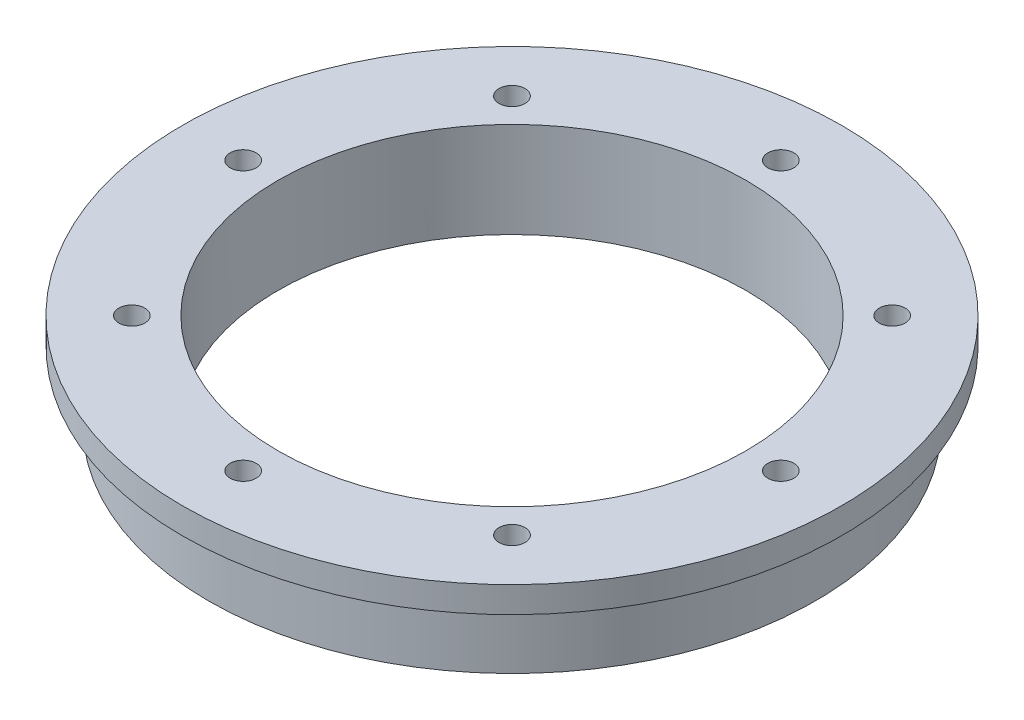
ISO-10303-21;
HEADER;
FILE_DESCRIPTION(('STEP AP214'),'2;1');
FILE_NAME('part.step','',(''),(''),'','','');
FILE_SCHEMA(('AUTOMOTIVE_DESIGN { 1 0 10303 214 1 1 1 1 }'));
ENDSEC;
DATA;
#1=APPLICATION_CONTEXT('core data for automotive mechanical design processes');
#2=APPLICATION_PROTOCOL_DEFINITION('international standard','automotive_design',2000,#1);
#3=PRODUCT_CONTEXT('',#1,'mechanical');
#4=PRODUCT('Part','Part','',(#3));
#5=PRODUCT_RELATED_PRODUCT_CATEGORY('part','',(#4));
#6=PRODUCT_DEFINITION_FORMATION('','',#4);
#7=PRODUCT_DEFINITION_CONTEXT('part definition',#1,'design');
#8=PRODUCT_DEFINITION('design','',#6,#7);
#9=PRODUCT_DEFINITION_SHAPE('','',#8);
#10=(LENGTH_UNIT() NAMED_UNIT(*) SI_UNIT(.MILLI.,.METRE.));
#11=(NAMED_UNIT(*) PLANE_ANGLE_UNIT() SI_UNIT($,.RADIAN.));
#12=(NAMED_UNIT(*) SI_UNIT($,.STERADIAN.) SOLID_ANGLE_UNIT());
#13=UNCERTAINTY_MEASURE_WITH_UNIT(LENGTH_MEASURE(1.E-05),#10,'distance_accuracy_value','');
#14=(GEOMETRIC_REPRESENTATION_CONTEXT(3) GLOBAL_UNCERTAINTY_ASSIGNED_CONTEXT((#13)) GLOBAL_UNIT_ASSIGNED_CONTEXT((#10,
#11,#12)) REPRESENTATION_CONTEXT('',''));
#15=CARTESIAN_POINT('',(0.,0.,0.));
#16=DIRECTION('',(0.,0.,1.));
#17=DIRECTION('',(1.,0.,0.));
#18=AXIS2_PLACEMENT_3D('',#15,#16,#17);
#19=CARTESIAN_POINT('',(0.,3.,0.));
#20=DIRECTION('',(0.,1.,0.));
#21=DIRECTION('',(0.,0.,1.));
#22=AXIS2_PLACEMENT_3D('',#19,#20,#21);
#23=PLANE('',#22);
#24=CARTESIAN_POINT('',(0.,3.,31.));
#25=DIRECTION('',(0.,-1.,0.));
#26=DIRECTION('',(0.,0.,-1.));
#27=AXIS2_PLACEMENT_3D('',#24,#25,#26);
#28=CIRCLE('',#27,1.5);
#29=CARTESIAN_POINT('',(0.,3.,29.5));
#30=VERTEX_POINT('',#29);
#31=EDGE_CURVE('E80',#30,#30,#28,.T.);
#32=ORIENTED_EDGE('',*,*,#31,.T.);
#33=EDGE_LOOP('',(#32));
#34=FACE_BOUND('',#33,.T.);
#35=CARTESIAN_POINT('',(21.920310216783,3.,21.920310216783));
#36=DIRECTION('',(0.,-1.,0.));
#37=DIRECTION('',(0.,0.,-1.));
#38=AXIS2_PLACEMENT_3D('',#35,#36,#37);
#39=CIRCLE('',#38,1.5);
#40=CARTESIAN_POINT('',(21.920310216783,3.,20.420310216783));
#41=VERTEX_POINT('',#40);
#42=EDGE_CURVE('E140',#41,#41,#39,.T.);
#43=ORIENTED_EDGE('',*,*,#42,.T.);
#44=EDGE_LOOP('',(#43));
#45=FACE_BOUND('',#44,.T.);
#46=CARTESIAN_POINT('',(31.,3.,0.));
#47=DIRECTION('',(0.,-1.,0.));
#48=DIRECTION('',(0.,0.,-1.));
#49=AXIS2_PLACEMENT_3D('',#46,#47,#48);
#50=CIRCLE('',#49,1.5);
#51=CARTESIAN_POINT('',(31.,3.,-1.5));
#52=VERTEX_POINT('',#51);
#53=EDGE_CURVE('E128',#52,#52,#50,.T.);
#54=ORIENTED_EDGE('',*,*,#53,.T.);
#55=EDGE_LOOP('',(#54));
#56=FACE_BOUND('',#55,.T.);
#57=CARTESIAN_POINT('',(21.920310216783,3.,-21.920310216783));
#58=DIRECTION('',(0.,-1.,0.));
#59=DIRECTION('',(0.,0.,-1.));
#60=AXIS2_PLACEMENT_3D('',#57,#58,#59);
#61=CIRCLE('',#60,1.5);
#62=CARTESIAN_POINT('',(21.920310216783,3.,-23.420310216783));
#63=VERTEX_POINT('',#62);
#64=EDGE_CURVE('E125',#63,#63,#61,.T.);
#65=ORIENTED_EDGE('',*,*,#64,.T.);
#66=EDGE_LOOP('',(#65));
#67=FACE_BOUND('',#66,.T.);
#68=CARTESIAN_POINT('',(0.,3.,-31.));
#69=DIRECTION('',(0.,-1.,0.));
#70=DIRECTION('',(0.,0.,-1.));
#71=AXIS2_PLACEMENT_3D('',#68,#69,#70);
#72=CIRCLE('',#71,1.5);
#73=CARTESIAN_POINT('',(0.,3.,-32.5));
#74=VERTEX_POINT('',#73);
#75=EDGE_CURVE('E112',#74,#74,#72,.T.);
#76=ORIENTED_EDGE('',*,*,#75,.T.);
#77=EDGE_LOOP('',(#76));
#78=FACE_BOUND('',#77,.T.);
#79=CARTESIAN_POINT('',(-21.920310216783,3.,-21.920310216783));
#80=DIRECTION('',(0.,-1.,0.));
#81=DIRECTION('',(0.,0.,-1.));
#82=AXIS2_PLACEMENT_3D('',#79,#80,#81);
#83=CIRCLE('',#82,1.5);
#84=CARTESIAN_POINT('',(-21.920310216783,3.,-23.420310216783));
#85=VERTEX_POINT('',#84);
#86=EDGE_CURVE('E106',#85,#85,#83,.T.);
#87=ORIENTED_EDGE('',*,*,#86,.T.);
#88=EDGE_LOOP('',(#87));
#89=FACE_BOUND('',#88,.T.);
#90=CARTESIAN_POINT('',(-31.,3.,0.));
#91=DIRECTION('',(0.,-1.,0.));
#92=DIRECTION('',(0.,0.,-1.));
#93=AXIS2_PLACEMENT_3D('',#90,#91,#92);
#94=CIRCLE('',#93,1.5);
#95=CARTESIAN_POINT('',(-31.,3.,-1.50000000000001));
#96=VERTEX_POINT('',#95);
#97=EDGE_CURVE('E96',#96,#96,#94,.T.);
#98=ORIENTED_EDGE('',*,*,#97,.T.);
#99=EDGE_LOOP('',(#98));
#100=FACE_BOUND('',#99,.T.);
#101=CARTESIAN_POINT('',(-21.920310216783,3.,21.920310216783));
#102=DIRECTION('',(0.,-1.,0.));
#103=DIRECTION('',(0.,0.,-1.));
#104=AXIS2_PLACEMENT_3D('',#101,#102,#103);
#105=CIRCLE('',#104,1.5);
#106=CARTESIAN_POINT('',(-21.920310216783,3.,20.420310216783));
#107=VERTEX_POINT('',#106);
#108=EDGE_CURVE('E87',#107,#107,#105,.T.);
#109=ORIENTED_EDGE('',*,*,#108,.T.);
#110=EDGE_LOOP('',(#109));
#111=FACE_BOUND('',#110,.T.);
#112=CARTESIAN_POINT('',(0.,3.,0.));
#113=DIRECTION('',(0.,1.,0.));
#114=DIRECTION('',(0.,0.,1.));
#115=AXIS2_PLACEMENT_3D('',#112,#113,#114);
#116=CIRCLE('',#115,38.);
#117=CARTESIAN_POINT('',(0.,3.,38.));
#118=VERTEX_POINT('',#117);
#119=EDGE_CURVE('E49',#118,#118,#116,.T.);
#120=ORIENTED_EDGE('',*,*,#119,.T.);
#121=EDGE_LOOP('',(#120));
#122=FACE_BOUND('',#121,.T.);
#123=CARTESIAN_POINT('',(0.,3.,0.));
#124=DIRECTION('',(0.,1.,0.));
#125=DIRECTION('',(0.,0.,1.));
#126=AXIS2_PLACEMENT_3D('',#123,#124,#125);
#127=CIRCLE('',#126,27.);
#128=CARTESIAN_POINT('',(0.,3.,27.));
#129=VERTEX_POINT('',#128);
#130=EDGE_CURVE('E62',#129,#129,#127,.T.);
#131=ORIENTED_EDGE('',*,*,#130,.F.);
#132=EDGE_LOOP('',(#131));
#133=FACE_BOUND('',#132,.T.);
#134=ADVANCED_FACE('F41',(#34,#45,#56,#67,#78,#89,#100,#111,#122,#133),#23,.T.);
#135=CARTESIAN_POINT('',(0.,0.,0.));
#136=DIRECTION('',(0.,1.,0.));
#137=DIRECTION('',(0.,0.,1.));
#138=AXIS2_PLACEMENT_3D('',#135,#136,#137);
#139=PLANE('',#138);
#140=CARTESIAN_POINT('',(0.,0.,0.));
#141=DIRECTION('',(0.,-1.,0.));
#142=DIRECTION('',(0.,0.,-1.));
#143=AXIS2_PLACEMENT_3D('',#140,#141,#142);
#144=CIRCLE('',#143,35.);
#145=CARTESIAN_POINT('',(0.,0.,-35.));
#146=VERTEX_POINT('',#145);
#147=EDGE_CURVE('E10',#146,#146,#144,.T.);
#148=ORIENTED_EDGE('',*,*,#147,.F.);
#149=EDGE_LOOP('',(#148));
#150=FACE_BOUND('',#149,.T.);
#151=CARTESIAN_POINT('',(0.,0.,0.));
#152=DIRECTION('',(0.,1.,0.));
#153=DIRECTION('',(0.,0.,1.));
#154=AXIS2_PLACEMENT_3D('',#151,#152,#153);
#155=CIRCLE('',#154,38.);
#156=CARTESIAN_POINT('',(0.,0.,38.));
#157=VERTEX_POINT('',#156);
#158=EDGE_CURVE('E44',#157,#157,#155,.T.);
#159=ORIENTED_EDGE('',*,*,#158,.F.);
#160=EDGE_LOOP('',(#159));
#161=FACE_BOUND('',#160,.T.);
#162=ADVANCED_FACE('F187',(#150,#161),#139,.F.);
#163=CARTESIAN_POINT('',(0.,3.,0.));
#164=DIRECTION('',(0.,-1.,0.));
#165=DIRECTION('',(0.,0.,-1.));
#166=AXIS2_PLACEMENT_3D('',#163,#164,#165);
#167=CYLINDRICAL_SURFACE('',#166,38.);
#168=ORIENTED_EDGE('',*,*,#119,.F.);
#169=EDGE_LOOP('',(#168));
#170=FACE_BOUND('',#169,.T.);
#171=ORIENTED_EDGE('',*,*,#158,.T.);
#172=EDGE_LOOP('',(#171));
#173=FACE_BOUND('',#172,.T.);
#174=ADVANCED_FACE('F43',(#170,#173),#167,.T.);
#175=CARTESIAN_POINT('',(0.,3.,0.));
#176=DIRECTION('',(0.,-1.,0.));
#177=DIRECTION('',(0.,0.,-1.));
#178=AXIS2_PLACEMENT_3D('',#175,#176,#177);
#179=CYLINDRICAL_SURFACE('',#178,27.);
#180=ORIENTED_EDGE('',*,*,#130,.T.);
#181=EDGE_LOOP('',(#180));
#182=FACE_BOUND('',#181,.T.);
#183=CARTESIAN_POINT('',(0.,-8.,0.));
#184=DIRECTION('',(0.,-1.,0.));
#185=DIRECTION('',(0.,0.,-1.));
#186=AXIS2_PLACEMENT_3D('',#183,#184,#185);
#187=CIRCLE('',#186,27.);
#188=CARTESIAN_POINT('',(0.,-8.,-27.));
#189=VERTEX_POINT('',#188);
#190=EDGE_CURVE('E74',#189,#189,#187,.T.);
#191=ORIENTED_EDGE('',*,*,#190,.T.);
#192=EDGE_LOOP('',(#191));
#193=FACE_BOUND('',#192,.T.);
#194=ADVANCED_FACE('F155',(#182,#193),#179,.F.);
#195=CARTESIAN_POINT('',(0.,-8.,0.));
#196=DIRECTION('',(0.,-1.,0.));
#197=DIRECTION('',(0.,0.,-1.));
#198=AXIS2_PLACEMENT_3D('',#195,#196,#197);
#199=PLANE('',#198);
#200=CARTESIAN_POINT('',(0.,-8.,31.));
#201=DIRECTION('',(0.,-1.,0.));
#202=DIRECTION('',(0.,0.,-1.));
#203=AXIS2_PLACEMENT_3D('',#200,#201,#202);
#204=CIRCLE('',#203,1.5);
#205=CARTESIAN_POINT('',(0.,-8.,29.5));
#206=VERTEX_POINT('',#205);
#207=EDGE_CURVE('E84',#206,#206,#204,.T.);
#208=ORIENTED_EDGE('',*,*,#207,.F.);
#209=EDGE_LOOP('',(#208));
#210=FACE_BOUND('',#209,.T.);
#211=CARTESIAN_POINT('',(21.920310216783,-8.,21.920310216783));
#212=DIRECTION('',(0.,-1.,0.));
#213=DIRECTION('',(0.,0.,-1.));
#214=AXIS2_PLACEMENT_3D('',#211,#212,#213);
#215=CIRCLE('',#214,1.5);
#216=CARTESIAN_POINT('',(21.920310216783,-8.,20.420310216783));
#217=VERTEX_POINT('',#216);
#218=EDGE_CURVE('E133',#217,#217,#215,.T.);
#219=ORIENTED_EDGE('',*,*,#218,.F.);
#220=EDGE_LOOP('',(#219));
#221=FACE_BOUND('',#220,.T.);
#222=CARTESIAN_POINT('',(31.,-8.,0.));
#223=DIRECTION('',(0.,-1.,0.));
#224=DIRECTION('',(0.,0.,-1.));
#225=AXIS2_PLACEMENT_3D('',#222,#223,#224);
#226=CIRCLE('',#225,1.5);
#227=CARTESIAN_POINT('',(31.,-8.,-1.5));
#228=VERTEX_POINT('',#227);
#229=EDGE_CURVE('E127',#228,#228,#226,.T.);
#230=ORIENTED_EDGE('',*,*,#229,.F.);
#231=EDGE_LOOP('',(#230));
#232=FACE_BOUND('',#231,.T.);
#233=CARTESIAN_POINT('',(21.920310216783,-8.,-21.920310216783));
#234=DIRECTION('',(0.,-1.,0.));
#235=DIRECTION('',(0.,0.,-1.));
#236=AXIS2_PLACEMENT_3D('',#233,#234,#235);
#237=CIRCLE('',#236,1.5);
#238=CARTESIAN_POINT('',(21.920310216783,-8.,-23.420310216783));
#239=VERTEX_POINT('',#238);
#240=EDGE_CURVE('E117',#239,#239,#237,.T.);
#241=ORIENTED_EDGE('',*,*,#240,.F.);
#242=EDGE_LOOP('',(#241));
#243=FACE_BOUND('',#242,.T.);
#244=CARTESIAN_POINT('',(0.,-8.,-31.));
#245=DIRECTION('',(0.,-1.,0.));
#246=DIRECTION('',(0.,0.,-1.));
#247=AXIS2_PLACEMENT_3D('',#244,#245,#246);
#248=CIRCLE('',#247,1.5);
#249=CARTESIAN_POINT('',(0.,-8.,-32.5));
#250=VERTEX_POINT('',#249);
#251=EDGE_CURVE('E109',#250,#250,#248,.T.);
#252=ORIENTED_EDGE('',*,*,#251,.F.);
#253=EDGE_LOOP('',(#252));
#254=FACE_BOUND('',#253,.T.);
#255=CARTESIAN_POINT('',(-21.920310216783,-8.,-21.920310216783));
#256=DIRECTION('',(0.,-1.,0.));
#257=DIRECTION('',(0.,0.,-1.));
#258=AXIS2_PLACEMENT_3D('',#255,#256,#257);
#259=CIRCLE('',#258,1.5);
#260=CARTESIAN_POINT('',(-21.920310216783,-8.,-23.420310216783));
#261=VERTEX_POINT('',#260);
#262=EDGE_CURVE('E105',#261,#261,#259,.T.);
#263=ORIENTED_EDGE('',*,*,#262,.F.);
#264=EDGE_LOOP('',(#263));
#265=FACE_BOUND('',#264,.T.);
#266=CARTESIAN_POINT('',(-31.,-8.,0.));
#267=DIRECTION('',(0.,-1.,0.));
#268=DIRECTION('',(0.,0.,-1.));
#269=AXIS2_PLACEMENT_3D('',#266,#267,#268);
#270=CIRCLE('',#269,1.5);
#271=CARTESIAN_POINT('',(-31.,-8.,-1.50000000000001));
#272=VERTEX_POINT('',#271);
#273=EDGE_CURVE('E93',#272,#272,#270,.T.);
#274=ORIENTED_EDGE('',*,*,#273,.F.);
#275=EDGE_LOOP('',(#274));
#276=FACE_BOUND('',#275,.T.);
#277=CARTESIAN_POINT('',(-21.920310216783,-8.,21.920310216783));
#278=DIRECTION('',(0.,-1.,0.));
#279=DIRECTION('',(0.,0.,-1.));
#280=AXIS2_PLACEMENT_3D('',#277,#278,#279);
#281=CIRCLE('',#280,1.5);
#282=CARTESIAN_POINT('',(-21.920310216783,-8.,20.420310216783));
#283=VERTEX_POINT('',#282);
#284=EDGE_CURVE('E89',#283,#283,#281,.T.);
#285=ORIENTED_EDGE('',*,*,#284,.F.);
#286=EDGE_LOOP('',(#285));
#287=FACE_BOUND('',#286,.T.);
#288=CARTESIAN_POINT('',(0.,-8.,0.));
#289=DIRECTION('',(0.,-1.,0.));
#290=DIRECTION('',(0.,0.,-1.));
#291=AXIS2_PLACEMENT_3D('',#288,#289,#290);
#292=CIRCLE('',#291,35.);
#293=CARTESIAN_POINT('',(0.,-8.,-35.));
#294=VERTEX_POINT('',#293);
#295=EDGE_CURVE('E56',#294,#294,#292,.T.);
#296=ORIENTED_EDGE('',*,*,#295,.T.);
#297=EDGE_LOOP('',(#296));
#298=FACE_BOUND('',#297,.T.);
#299=ORIENTED_EDGE('',*,*,#190,.F.);
#300=EDGE_LOOP('',(#299));
#301=FACE_BOUND('',#300,.T.);
#302=ADVANCED_FACE('F146',(#210,#221,#232,#243,#254,#265,#276,#287,#298,#301),#199,.T.);
#303=CARTESIAN_POINT('',(0.,-8.,0.));
#304=DIRECTION('',(0.,1.,0.));
#305=DIRECTION('',(0.,0.,1.));
#306=AXIS2_PLACEMENT_3D('',#303,#304,#305);
#307=CYLINDRICAL_SURFACE('',#306,35.);
#308=ORIENTED_EDGE('',*,*,#295,.F.);
#309=EDGE_LOOP('',(#308));
#310=FACE_BOUND('',#309,.T.);
#311=ORIENTED_EDGE('',*,*,#147,.T.);
#312=EDGE_LOOP('',(#311));
#313=FACE_BOUND('',#312,.T.);
#314=ADVANCED_FACE('F151',(#310,#313),#307,.T.);
#315=CARTESIAN_POINT('',(-21.920310216783,3.,21.920310216783));
#316=DIRECTION('',(0.,-1.,0.));
#317=DIRECTION('',(0.,0.,-1.));
#318=AXIS2_PLACEMENT_3D('',#315,#316,#317);
#319=CYLINDRICAL_SURFACE('',#318,1.5);
#320=ORIENTED_EDGE('',*,*,#108,.F.);
#321=EDGE_LOOP('',(#320));
#322=FACE_BOUND('',#321,.T.);
#323=ORIENTED_EDGE('',*,*,#284,.T.);
#324=EDGE_LOOP('',(#323));
#325=FACE_BOUND('',#324,.T.);
#326=ADVANCED_FACE('F167',(#322,#325),#319,.F.);
#327=CARTESIAN_POINT('',(-31.,3.,0.));
#328=DIRECTION('',(0.,-1.,0.));
#329=DIRECTION('',(0.,0.,-1.));
#330=AXIS2_PLACEMENT_3D('',#327,#328,#329);
#331=CYLINDRICAL_SURFACE('',#330,1.5);
#332=ORIENTED_EDGE('',*,*,#97,.F.);
#333=EDGE_LOOP('',(#332));
#334=FACE_BOUND('',#333,.T.);
#335=ORIENTED_EDGE('',*,*,#273,.T.);
#336=EDGE_LOOP('',(#335));
#337=FACE_BOUND('',#336,.T.);
#338=ADVANCED_FACE('F175',(#334,#337),#331,.F.);
#339=CARTESIAN_POINT('',(-21.920310216783,3.,-21.920310216783));
#340=DIRECTION('',(0.,-1.,0.));
#341=DIRECTION('',(0.,0.,-1.));
#342=AXIS2_PLACEMENT_3D('',#339,#340,#341);
#343=CYLINDRICAL_SURFACE('',#342,1.5);
#344=ORIENTED_EDGE('',*,*,#86,.F.);
#345=EDGE_LOOP('',(#344));
#346=FACE_BOUND('',#345,.T.);
#347=ORIENTED_EDGE('',*,*,#262,.T.);
#348=EDGE_LOOP('',(#347));
#349=FACE_BOUND('',#348,.T.);
#350=ADVANCED_FACE('F177',(#346,#349),#343,.F.);
#351=CARTESIAN_POINT('',(0.,3.,-31.));
#352=DIRECTION('',(0.,-1.,0.));
#353=DIRECTION('',(0.,0.,-1.));
#354=AXIS2_PLACEMENT_3D('',#351,#352,#353);
#355=CYLINDRICAL_SURFACE('',#354,1.5);
#356=ORIENTED_EDGE('',*,*,#75,.F.);
#357=EDGE_LOOP('',(#356));
#358=FACE_BOUND('',#357,.T.);
#359=ORIENTED_EDGE('',*,*,#251,.T.);
#360=EDGE_LOOP('',(#359));
#361=FACE_BOUND('',#360,.T.);
#362=ADVANCED_FACE('F255',(#358,#361),#355,.F.);
#363=CARTESIAN_POINT('',(21.920310216783,3.,-21.920310216783));
#364=DIRECTION('',(0.,-1.,0.));
#365=DIRECTION('',(0.,0.,-1.));
#366=AXIS2_PLACEMENT_3D('',#363,#364,#365);
#367=CYLINDRICAL_SURFACE('',#366,1.5);
#368=ORIENTED_EDGE('',*,*,#64,.F.);
#369=EDGE_LOOP('',(#368));
#370=FACE_BOUND('',#369,.T.);
#371=ORIENTED_EDGE('',*,*,#240,.T.);
#372=EDGE_LOOP('',(#371));
#373=FACE_BOUND('',#372,.T.);
#374=ADVANCED_FACE('F261',(#370,#373),#367,.F.);
#375=CARTESIAN_POINT('',(31.,3.,0.));
#376=DIRECTION('',(0.,-1.,0.));
#377=DIRECTION('',(0.,0.,-1.));
#378=AXIS2_PLACEMENT_3D('',#375,#376,#377);
#379=CYLINDRICAL_SURFACE('',#378,1.5);
#380=ORIENTED_EDGE('',*,*,#53,.F.);
#381=EDGE_LOOP('',(#380));
#382=FACE_BOUND('',#381,.T.);
#383=ORIENTED_EDGE('',*,*,#229,.T.);
#384=EDGE_LOOP('',(#383));
#385=FACE_BOUND('',#384,.T.);
#386=ADVANCED_FACE('F275',(#382,#385),#379,.F.);
#387=CARTESIAN_POINT('',(21.920310216783,3.,21.920310216783));
#388=DIRECTION('',(0.,-1.,0.));
#389=DIRECTION('',(0.,0.,-1.));
#390=AXIS2_PLACEMENT_3D('',#387,#388,#389);
#391=CYLINDRICAL_SURFACE('',#390,1.5);
#392=ORIENTED_EDGE('',*,*,#42,.F.);
#393=EDGE_LOOP('',(#392));
#394=FACE_BOUND('',#393,.T.);
#395=ORIENTED_EDGE('',*,*,#218,.T.);
#396=EDGE_LOOP('',(#395));
#397=FACE_BOUND('',#396,.T.);
#398=ADVANCED_FACE('F281',(#394,#397),#391,.F.);
#399=CARTESIAN_POINT('',(0.,3.,31.));
#400=DIRECTION('',(0.,-1.,0.));
#401=DIRECTION('',(0.,0.,-1.));
#402=AXIS2_PLACEMENT_3D('',#399,#400,#401);
#403=CYLINDRICAL_SURFACE('',#402,1.5);
#404=ORIENTED_EDGE('',*,*,#31,.F.);
#405=EDGE_LOOP('',(#404));
#406=FACE_BOUND('',#405,.T.);
#407=ORIENTED_EDGE('',*,*,#207,.T.);
#408=EDGE_LOOP('',(#407));
#409=FACE_BOUND('',#408,.T.);
#410=ADVANCED_FACE('F150',(#406,#409),#403,.F.);
#411=CLOSED_SHELL('',(#134,#162,#174,#194,#302,#314,#326,#338,#350,#362,#374,#386,#398,#410));
#412=MANIFOLD_SOLID_BREP('B2',#411);
#413=ADVANCED_BREP_SHAPE_REPRESENTATION('',(#18,#412),#14);
#414=SHAPE_DEFINITION_REPRESENTATION(#9,#413);
ENDSEC;
END-ISO-10303-21;
